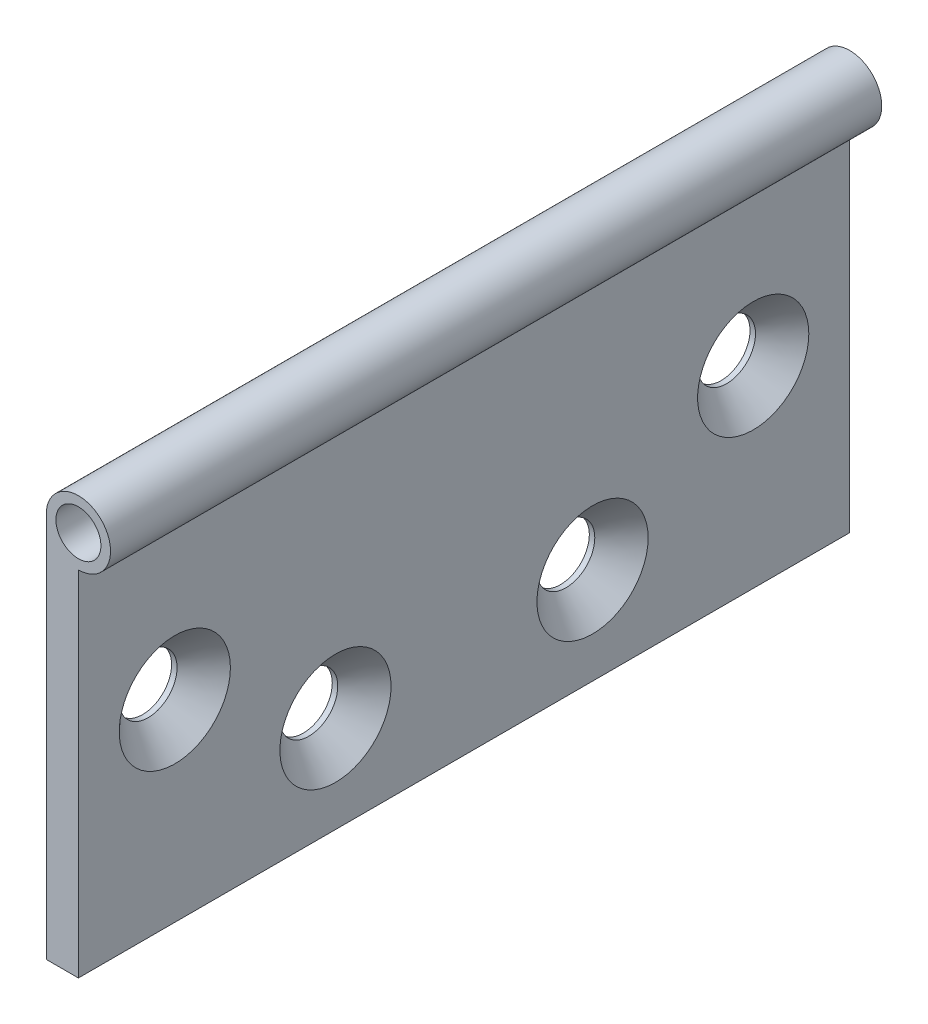
ISO-10303-21;
HEADER;
FILE_DESCRIPTION(('STEP AP214'),'2;1');
FILE_NAME('part.step','',(''),(''),'','','');
FILE_SCHEMA(('AUTOMOTIVE_DESIGN { 1 0 10303 214 1 1 1 1 }'));
ENDSEC;
DATA;
#1=APPLICATION_CONTEXT('core data for automotive mechanical design processes');
#2=APPLICATION_PROTOCOL_DEFINITION('international standard','automotive_design',2000,#1);
#3=PRODUCT_CONTEXT('',#1,'mechanical');
#4=PRODUCT('Part','Part','',(#3));
#5=PRODUCT_RELATED_PRODUCT_CATEGORY('part','',(#4));
#6=PRODUCT_DEFINITION_FORMATION('','',#4);
#7=PRODUCT_DEFINITION_CONTEXT('part definition',#1,'design');
#8=PRODUCT_DEFINITION('design','',#6,#7);
#9=PRODUCT_DEFINITION_SHAPE('','',#8);
#10=(LENGTH_UNIT() NAMED_UNIT(*) SI_UNIT(.MILLI.,.METRE.));
#11=(NAMED_UNIT(*) PLANE_ANGLE_UNIT() SI_UNIT($,.RADIAN.));
#12=(NAMED_UNIT(*) SI_UNIT($,.STERADIAN.) SOLID_ANGLE_UNIT());
#13=UNCERTAINTY_MEASURE_WITH_UNIT(LENGTH_MEASURE(1.E-05),#10,'distance_accuracy_value','');
#14=(GEOMETRIC_REPRESENTATION_CONTEXT(3) GLOBAL_UNCERTAINTY_ASSIGNED_CONTEXT((#13)) GLOBAL_UNIT_ASSIGNED_CONTEXT((#10,
#11,#12)) REPRESENTATION_CONTEXT('',''));
#15=CARTESIAN_POINT('',(0.,0.,0.));
#16=DIRECTION('',(0.,0.,1.));
#17=DIRECTION('',(1.,0.,0.));
#18=AXIS2_PLACEMENT_3D('',#15,#16,#17);
#19=CARTESIAN_POINT('',(5.,0.,60.));
#20=DIRECTION('',(-1.,0.,0.));
#21=DIRECTION('',(0.,0.,1.));
#22=AXIS2_PLACEMENT_3D('',#19,#20,#21);
#23=PLANE('',#22);
#24=CARTESIAN_POINT('',(5.,30.,-45.));
#25=DIRECTION('',(1.,0.,0.));
#26=DIRECTION('',(0.,0.,-1.));
#27=AXIS2_PLACEMENT_3D('',#24,#25,#26);
#28=CIRCLE('',#27,8.65);
#29=CARTESIAN_POINT('',(5.,30.,-53.65));
#30=VERTEX_POINT('',#29);
#31=EDGE_CURVE('E147',#30,#30,#28,.T.);
#32=ORIENTED_EDGE('',*,*,#31,.F.);
#33=EDGE_LOOP('',(#32));
#34=FACE_BOUND('',#33,.T.);
#35=CARTESIAN_POINT('',(5.,15.,-20.));
#36=DIRECTION('',(1.,0.,0.));
#37=DIRECTION('',(0.,0.,-1.));
#38=AXIS2_PLACEMENT_3D('',#35,#36,#37);
#39=CIRCLE('',#38,8.65);
#40=CARTESIAN_POINT('',(5.,15.,-28.65));
#41=VERTEX_POINT('',#40);
#42=EDGE_CURVE('E138',#41,#41,#39,.T.);
#43=ORIENTED_EDGE('',*,*,#42,.F.);
#44=EDGE_LOOP('',(#43));
#45=FACE_BOUND('',#44,.T.);
#46=CARTESIAN_POINT('',(5.,30.,45.));
#47=DIRECTION('',(1.,0.,0.));
#48=DIRECTION('',(0.,0.,-1.));
#49=AXIS2_PLACEMENT_3D('',#46,#47,#48);
#50=CIRCLE('',#49,8.65);
#51=CARTESIAN_POINT('',(5.,30.,36.35));
#52=VERTEX_POINT('',#51);
#53=EDGE_CURVE('E129',#52,#52,#50,.T.);
#54=ORIENTED_EDGE('',*,*,#53,.F.);
#55=EDGE_LOOP('',(#54));
#56=FACE_BOUND('',#55,.T.);
#57=CARTESIAN_POINT('',(5.,15.,20.));
#58=DIRECTION('',(1.,0.,0.));
#59=DIRECTION('',(0.,0.,-1.));
#60=AXIS2_PLACEMENT_3D('',#57,#58,#59);
#61=CIRCLE('',#60,8.65);
#62=CARTESIAN_POINT('',(5.,15.,11.35));
#63=VERTEX_POINT('',#62);
#64=EDGE_CURVE('E120',#63,#63,#61,.T.);
#65=ORIENTED_EDGE('',*,*,#64,.F.);
#66=EDGE_LOOP('',(#65));
#67=FACE_BOUND('',#66,.T.);
#68=DIRECTION('',(0.,0.,-1.));
#69=VECTOR('',#68,1.);
#70=CARTESIAN_POINT('',(5.,55.,60.));
#71=LINE('',#70,#69);
#72=CARTESIAN_POINT('',(5.,55.,60.));
#73=VERTEX_POINT('',#72);
#74=CARTESIAN_POINT('',(5.,55.,-60.));
#75=VERTEX_POINT('',#74);
#76=EDGE_CURVE('E91',#73,#75,#71,.T.);
#77=ORIENTED_EDGE('',*,*,#76,.F.);
#78=DIRECTION('',(0.,1.,0.));
#79=VECTOR('',#78,1.);
#80=CARTESIAN_POINT('',(5.,0.,60.));
#81=LINE('',#80,#79);
#82=CARTESIAN_POINT('',(5.,0.,60.));
#83=VERTEX_POINT('',#82);
#84=EDGE_CURVE('E79',#83,#73,#81,.T.);
#85=ORIENTED_EDGE('',*,*,#84,.F.);
#86=DIRECTION('',(0.,0.,-1.));
#87=VECTOR('',#86,1.);
#88=CARTESIAN_POINT('',(5.,0.,60.));
#89=LINE('',#88,#87);
#90=CARTESIAN_POINT('',(5.,0.,-60.));
#91=VERTEX_POINT('',#90);
#92=EDGE_CURVE('E60',#83,#91,#89,.T.);
#93=ORIENTED_EDGE('',*,*,#92,.T.);
#94=DIRECTION('',(0.,1.,0.));
#95=VECTOR('',#94,1.);
#96=CARTESIAN_POINT('',(5.,0.,-60.));
#97=LINE('',#96,#95);
#98=EDGE_CURVE('E77',#91,#75,#97,.T.);
#99=ORIENTED_EDGE('',*,*,#98,.T.);
#100=EDGE_LOOP('',(#77,#85,#93,#99));
#101=FACE_BOUND('',#100,.T.);
#102=ADVANCED_FACE('F44',(#34,#45,#56,#67,#101),#23,.F.);
#103=CARTESIAN_POINT('',(0.,0.,60.));
#104=DIRECTION('',(-1.,0.,0.));
#105=DIRECTION('',(0.,0.,1.));
#106=AXIS2_PLACEMENT_3D('',#103,#104,#105);
#107=PLANE('',#106);
#108=CARTESIAN_POINT('',(0.,30.,-45.));
#109=DIRECTION('',(1.,0.,0.));
#110=DIRECTION('',(0.,0.,-1.));
#111=AXIS2_PLACEMENT_3D('',#108,#109,#110);
#112=CIRCLE('',#111,4.5);
#113=CARTESIAN_POINT('',(0.,30.,-49.5));
#114=VERTEX_POINT('',#113);
#115=EDGE_CURVE('E141',#114,#114,#112,.T.);
#116=ORIENTED_EDGE('',*,*,#115,.T.);
#117=EDGE_LOOP('',(#116));
#118=FACE_BOUND('',#117,.T.);
#119=CARTESIAN_POINT('',(0.,15.,-20.));
#120=DIRECTION('',(1.,0.,0.));
#121=DIRECTION('',(0.,0.,-1.));
#122=AXIS2_PLACEMENT_3D('',#119,#120,#121);
#123=CIRCLE('',#122,4.5);
#124=CARTESIAN_POINT('',(0.,15.,-24.5));
#125=VERTEX_POINT('',#124);
#126=EDGE_CURVE('E132',#125,#125,#123,.T.);
#127=ORIENTED_EDGE('',*,*,#126,.T.);
#128=EDGE_LOOP('',(#127));
#129=FACE_BOUND('',#128,.T.);
#130=CARTESIAN_POINT('',(0.,30.,45.));
#131=DIRECTION('',(1.,0.,0.));
#132=DIRECTION('',(0.,0.,-1.));
#133=AXIS2_PLACEMENT_3D('',#130,#131,#132);
#134=CIRCLE('',#133,4.5);
#135=CARTESIAN_POINT('',(0.,30.,40.5));
#136=VERTEX_POINT('',#135);
#137=EDGE_CURVE('E123',#136,#136,#134,.T.);
#138=ORIENTED_EDGE('',*,*,#137,.T.);
#139=EDGE_LOOP('',(#138));
#140=FACE_BOUND('',#139,.T.);
#141=CARTESIAN_POINT('',(0.,15.,20.));
#142=DIRECTION('',(1.,0.,0.));
#143=DIRECTION('',(0.,0.,-1.));
#144=AXIS2_PLACEMENT_3D('',#141,#142,#143);
#145=CIRCLE('',#144,4.5);
#146=CARTESIAN_POINT('',(0.,15.,15.5));
#147=VERTEX_POINT('',#146);
#148=EDGE_CURVE('E112',#147,#147,#145,.T.);
#149=ORIENTED_EDGE('',*,*,#148,.T.);
#150=EDGE_LOOP('',(#149));
#151=FACE_BOUND('',#150,.T.);
#152=DIRECTION('',(0.,1.,0.));
#153=VECTOR('',#152,1.);
#154=CARTESIAN_POINT('',(0.,0.,-60.));
#155=LINE('',#154,#153);
#156=CARTESIAN_POINT('',(0.,0.,-60.));
#157=VERTEX_POINT('',#156);
#158=CARTESIAN_POINT('',(0.,60.,-60.));
#159=VERTEX_POINT('',#158);
#160=EDGE_CURVE('E90',#157,#159,#155,.T.);
#161=ORIENTED_EDGE('',*,*,#160,.F.);
#162=DIRECTION('',(0.,0.,-1.));
#163=VECTOR('',#162,1.);
#164=CARTESIAN_POINT('',(0.,0.,60.));
#165=LINE('',#164,#163);
#166=CARTESIAN_POINT('',(0.,0.,60.));
#167=VERTEX_POINT('',#166);
#168=EDGE_CURVE('E52',#167,#157,#165,.T.);
#169=ORIENTED_EDGE('',*,*,#168,.F.);
#170=DIRECTION('',(0.,1.,0.));
#171=VECTOR('',#170,1.);
#172=CARTESIAN_POINT('',(0.,0.,60.));
#173=LINE('',#172,#171);
#174=CARTESIAN_POINT('',(0.,60.,60.));
#175=VERTEX_POINT('',#174);
#176=EDGE_CURVE('E95',#167,#175,#173,.T.);
#177=ORIENTED_EDGE('',*,*,#176,.T.);
#178=DIRECTION('',(0.,0.,-1.));
#179=VECTOR('',#178,1.);
#180=CARTESIAN_POINT('',(0.,60.,60.));
#181=LINE('',#180,#179);
#182=EDGE_CURVE('E11',#175,#159,#181,.T.);
#183=ORIENTED_EDGE('',*,*,#182,.T.);
#184=EDGE_LOOP('',(#161,#169,#177,#183));
#185=FACE_BOUND('',#184,.T.);
#186=ADVANCED_FACE('F155',(#118,#129,#140,#151,#185),#107,.T.);
#187=CARTESIAN_POINT('',(5.,0.,60.));
#188=DIRECTION('',(0.,-1.,0.));
#189=DIRECTION('',(0.,0.,-1.));
#190=AXIS2_PLACEMENT_3D('',#187,#188,#189);
#191=PLANE('',#190);
#192=DIRECTION('',(-1.,0.,0.));
#193=VECTOR('',#192,1.);
#194=CARTESIAN_POINT('',(5.,0.,-60.));
#195=LINE('',#194,#193);
#196=EDGE_CURVE('E88',#91,#157,#195,.T.);
#197=ORIENTED_EDGE('',*,*,#196,.F.);
#198=ORIENTED_EDGE('',*,*,#92,.F.);
#199=DIRECTION('',(-1.,0.,0.));
#200=VECTOR('',#199,1.);
#201=CARTESIAN_POINT('',(5.,0.,60.));
#202=LINE('',#201,#200);
#203=EDGE_CURVE('E81',#83,#167,#202,.T.);
#204=ORIENTED_EDGE('',*,*,#203,.T.);
#205=ORIENTED_EDGE('',*,*,#168,.T.);
#206=EDGE_LOOP('',(#197,#198,#204,#205));
#207=FACE_BOUND('',#206,.T.);
#208=ADVANCED_FACE('F93',(#207),#191,.T.);
#209=CARTESIAN_POINT('',(0.,0.,60.));
#210=DIRECTION('',(0.,0.,-1.));
#211=DIRECTION('',(-1.,0.,0.));
#212=AXIS2_PLACEMENT_3D('',#209,#210,#211);
#213=PLANE('',#212);
#214=CARTESIAN_POINT('',(5.,60.,60.));
#215=DIRECTION('',(0.,0.,1.));
#216=DIRECTION('',(1.,0.,0.));
#217=AXIS2_PLACEMENT_3D('',#214,#215,#216);
#218=CIRCLE('',#217,3.5);
#219=CARTESIAN_POINT('',(8.5,60.,60.));
#220=VERTEX_POINT('',#219);
#221=EDGE_CURVE('E109',#220,#220,#218,.T.);
#222=ORIENTED_EDGE('',*,*,#221,.F.);
#223=EDGE_LOOP('',(#222));
#224=FACE_BOUND('',#223,.T.);
#225=ORIENTED_EDGE('',*,*,#84,.T.);
#226=CARTESIAN_POINT('',(5.,60.,60.));
#227=DIRECTION('',(0.,0.,1.));
#228=DIRECTION('',(1.,0.,0.));
#229=AXIS2_PLACEMENT_3D('',#226,#227,#228);
#230=CIRCLE('',#229,5.);
#231=EDGE_CURVE('E105',#73,#175,#230,.T.);
#232=ORIENTED_EDGE('',*,*,#231,.T.);
#233=ORIENTED_EDGE('',*,*,#176,.F.);
#234=ORIENTED_EDGE('',*,*,#203,.F.);
#235=EDGE_LOOP('',(#225,#232,#233,#234));
#236=FACE_BOUND('',#235,.T.);
#237=ADVANCED_FACE('F188',(#224,#236),#213,.F.);
#238=CARTESIAN_POINT('',(0.,0.,-60.));
#239=DIRECTION('',(0.,0.,-1.));
#240=DIRECTION('',(-1.,0.,0.));
#241=AXIS2_PLACEMENT_3D('',#238,#239,#240);
#242=PLANE('',#241);
#243=CARTESIAN_POINT('',(5.,60.,-60.));
#244=DIRECTION('',(0.,0.,1.));
#245=DIRECTION('',(1.,0.,0.));
#246=AXIS2_PLACEMENT_3D('',#243,#244,#245);
#247=CIRCLE('',#246,3.5);
#248=CARTESIAN_POINT('',(8.5,60.,-60.));
#249=VERTEX_POINT('',#248);
#250=EDGE_CURVE('E108',#249,#249,#247,.T.);
#251=ORIENTED_EDGE('',*,*,#250,.T.);
#252=EDGE_LOOP('',(#251));
#253=FACE_BOUND('',#252,.T.);
#254=ORIENTED_EDGE('',*,*,#160,.T.);
#255=CARTESIAN_POINT('',(5.,60.,-60.));
#256=DIRECTION('',(0.,0.,1.));
#257=DIRECTION('',(1.,0.,0.));
#258=AXIS2_PLACEMENT_3D('',#255,#256,#257);
#259=CIRCLE('',#258,5.);
#260=EDGE_CURVE('E89',#75,#159,#259,.T.);
#261=ORIENTED_EDGE('',*,*,#260,.F.);
#262=ORIENTED_EDGE('',*,*,#98,.F.);
#263=ORIENTED_EDGE('',*,*,#196,.T.);
#264=EDGE_LOOP('',(#254,#261,#262,#263));
#265=FACE_BOUND('',#264,.T.);
#266=ADVANCED_FACE('F87',(#253,#265),#242,.T.);
#267=CARTESIAN_POINT('',(5.,60.,60.));
#268=DIRECTION('',(0.,0.,-1.));
#269=DIRECTION('',(-1.,0.,0.));
#270=AXIS2_PLACEMENT_3D('',#267,#268,#269);
#271=CYLINDRICAL_SURFACE('',#270,5.);
#272=ORIENTED_EDGE('',*,*,#231,.F.);
#273=ORIENTED_EDGE('',*,*,#76,.T.);
#274=ORIENTED_EDGE('',*,*,#260,.T.);
#275=ORIENTED_EDGE('',*,*,#182,.F.);
#276=EDGE_LOOP('',(#272,#273,#274,#275));
#277=FACE_BOUND('',#276,.T.);
#278=ADVANCED_FACE('F183',(#277),#271,.T.);
#279=CARTESIAN_POINT('',(5.,60.,-60.));
#280=DIRECTION('',(0.,0.,1.));
#281=DIRECTION('',(1.,0.,0.));
#282=AXIS2_PLACEMENT_3D('',#279,#280,#281);
#283=CYLINDRICAL_SURFACE('',#282,3.5);
#284=ORIENTED_EDGE('',*,*,#250,.F.);
#285=EDGE_LOOP('',(#284));
#286=FACE_BOUND('',#285,.T.);
#287=ORIENTED_EDGE('',*,*,#221,.T.);
#288=EDGE_LOOP('',(#287));
#289=FACE_BOUND('',#288,.T.);
#290=ADVANCED_FACE('F175',(#286,#289),#283,.F.);
#291=CARTESIAN_POINT('',(5.,15.,20.));
#292=DIRECTION('',(1.,0.,0.));
#293=DIRECTION('',(0.,0.,-1.));
#294=AXIS2_PLACEMENT_3D('',#291,#292,#293);
#295=CYLINDRICAL_SURFACE('',#294,4.5);
#296=ORIENTED_EDGE('',*,*,#148,.F.);
#297=EDGE_LOOP('',(#296));
#298=FACE_BOUND('',#297,.T.);
#299=CARTESIAN_POINT('',(0.850000000000001,15.,20.));
#300=DIRECTION('',(1.,0.,0.));
#301=DIRECTION('',(0.,0.,-1.));
#302=AXIS2_PLACEMENT_3D('',#299,#300,#301);
#303=CIRCLE('',#302,4.5);
#304=CARTESIAN_POINT('',(0.850000000000001,15.,15.5));
#305=VERTEX_POINT('',#304);
#306=EDGE_CURVE('E117',#305,#305,#303,.T.);
#307=ORIENTED_EDGE('',*,*,#306,.T.);
#308=EDGE_LOOP('',(#307));
#309=FACE_BOUND('',#308,.T.);
#310=ADVANCED_FACE('F165',(#298,#309),#295,.F.);
#311=CARTESIAN_POINT('',(5.,15.,20.));
#312=DIRECTION('',(1.,0.,0.));
#313=DIRECTION('',(0.,0.,-1.));
#314=AXIS2_PLACEMENT_3D('',#311,#312,#313);
#315=CONICAL_SURFACE('',#314,8.65,0.785398163397448);
#316=ORIENTED_EDGE('',*,*,#306,.F.);
#317=EDGE_LOOP('',(#316));
#318=FACE_BOUND('',#317,.T.);
#319=ORIENTED_EDGE('',*,*,#64,.T.);
#320=EDGE_LOOP('',(#319));
#321=FACE_BOUND('',#320,.T.);
#322=ADVANCED_FACE('F162',(#318,#321),#315,.F.);
#323=CARTESIAN_POINT('',(5.,30.,45.));
#324=DIRECTION('',(1.,0.,0.));
#325=DIRECTION('',(0.,0.,-1.));
#326=AXIS2_PLACEMENT_3D('',#323,#324,#325);
#327=CYLINDRICAL_SURFACE('',#326,4.5);
#328=ORIENTED_EDGE('',*,*,#137,.F.);
#329=EDGE_LOOP('',(#328));
#330=FACE_BOUND('',#329,.T.);
#331=CARTESIAN_POINT('',(0.850000000000001,30.,45.));
#332=DIRECTION('',(1.,0.,0.));
#333=DIRECTION('',(0.,0.,-1.));
#334=AXIS2_PLACEMENT_3D('',#331,#332,#333);
#335=CIRCLE('',#334,4.5);
#336=CARTESIAN_POINT('',(0.850000000000001,30.,40.5));
#337=VERTEX_POINT('',#336);
#338=EDGE_CURVE('E126',#337,#337,#335,.T.);
#339=ORIENTED_EDGE('',*,*,#338,.T.);
#340=EDGE_LOOP('',(#339));
#341=FACE_BOUND('',#340,.T.);
#342=ADVANCED_FACE('F164',(#330,#341),#327,.F.);
#343=CARTESIAN_POINT('',(5.,30.,45.));
#344=DIRECTION('',(1.,0.,0.));
#345=DIRECTION('',(0.,0.,-1.));
#346=AXIS2_PLACEMENT_3D('',#343,#344,#345);
#347=CONICAL_SURFACE('',#346,8.65,0.785398163397449);
#348=ORIENTED_EDGE('',*,*,#338,.F.);
#349=EDGE_LOOP('',(#348));
#350=FACE_BOUND('',#349,.T.);
#351=ORIENTED_EDGE('',*,*,#53,.T.);
#352=EDGE_LOOP('',(#351));
#353=FACE_BOUND('',#352,.T.);
#354=ADVANCED_FACE('F172',(#350,#353),#347,.F.);
#355=CARTESIAN_POINT('',(5.,15.,-20.));
#356=DIRECTION('',(1.,0.,0.));
#357=DIRECTION('',(0.,0.,-1.));
#358=AXIS2_PLACEMENT_3D('',#355,#356,#357);
#359=CYLINDRICAL_SURFACE('',#358,4.5);
#360=ORIENTED_EDGE('',*,*,#126,.F.);
#361=EDGE_LOOP('',(#360));
#362=FACE_BOUND('',#361,.T.);
#363=CARTESIAN_POINT('',(0.850000000000001,15.,-20.));
#364=DIRECTION('',(1.,0.,0.));
#365=DIRECTION('',(0.,0.,-1.));
#366=AXIS2_PLACEMENT_3D('',#363,#364,#365);
#367=CIRCLE('',#366,4.5);
#368=CARTESIAN_POINT('',(0.850000000000001,15.,-24.5));
#369=VERTEX_POINT('',#368);
#370=EDGE_CURVE('E135',#369,#369,#367,.T.);
#371=ORIENTED_EDGE('',*,*,#370,.T.);
#372=EDGE_LOOP('',(#371));
#373=FACE_BOUND('',#372,.T.);
#374=ADVANCED_FACE('F222',(#362,#373),#359,.F.);
#375=CARTESIAN_POINT('',(5.,15.,-20.));
#376=DIRECTION('',(1.,0.,0.));
#377=DIRECTION('',(0.,0.,-1.));
#378=AXIS2_PLACEMENT_3D('',#375,#376,#377);
#379=CONICAL_SURFACE('',#378,8.65,0.785398163397448);
#380=ORIENTED_EDGE('',*,*,#370,.F.);
#381=EDGE_LOOP('',(#380));
#382=FACE_BOUND('',#381,.T.);
#383=ORIENTED_EDGE('',*,*,#42,.T.);
#384=EDGE_LOOP('',(#383));
#385=FACE_BOUND('',#384,.T.);
#386=ADVANCED_FACE('F225',(#382,#385),#379,.F.);
#387=CARTESIAN_POINT('',(5.,30.,-45.));
#388=DIRECTION('',(1.,0.,0.));
#389=DIRECTION('',(0.,0.,-1.));
#390=AXIS2_PLACEMENT_3D('',#387,#388,#389);
#391=CYLINDRICAL_SURFACE('',#390,4.5);
#392=ORIENTED_EDGE('',*,*,#115,.F.);
#393=EDGE_LOOP('',(#392));
#394=FACE_BOUND('',#393,.T.);
#395=CARTESIAN_POINT('',(0.850000000000001,30.,-45.));
#396=DIRECTION('',(1.,0.,0.));
#397=DIRECTION('',(0.,0.,-1.));
#398=AXIS2_PLACEMENT_3D('',#395,#396,#397);
#399=CIRCLE('',#398,4.5);
#400=CARTESIAN_POINT('',(0.850000000000001,30.,-49.5));
#401=VERTEX_POINT('',#400);
#402=EDGE_CURVE('E144',#401,#401,#399,.T.);
#403=ORIENTED_EDGE('',*,*,#402,.T.);
#404=EDGE_LOOP('',(#403));
#405=FACE_BOUND('',#404,.T.);
#406=ADVANCED_FACE('F231',(#394,#405),#391,.F.);
#407=CARTESIAN_POINT('',(5.,30.,-45.));
#408=DIRECTION('',(1.,0.,0.));
#409=DIRECTION('',(0.,0.,-1.));
#410=AXIS2_PLACEMENT_3D('',#407,#408,#409);
#411=CONICAL_SURFACE('',#410,8.65,0.785398163397449);
#412=ORIENTED_EDGE('',*,*,#402,.F.);
#413=EDGE_LOOP('',(#412));
#414=FACE_BOUND('',#413,.T.);
#415=ORIENTED_EDGE('',*,*,#31,.T.);
#416=EDGE_LOOP('',(#415));
#417=FACE_BOUND('',#416,.T.);
#418=ADVANCED_FACE('F151',(#414,#417),#411,.F.);
#419=CLOSED_SHELL('',(#102,#186,#208,#237,#266,#278,#290,#310,#322,#342,#354,#374,#386,#406,#418));
#420=MANIFOLD_SOLID_BREP('B2',#419);
#421=ADVANCED_BREP_SHAPE_REPRESENTATION('',(#18,#420),#14);
#422=SHAPE_DEFINITION_REPRESENTATION(#9,#421);
ENDSEC;
END-ISO-10303-21;
